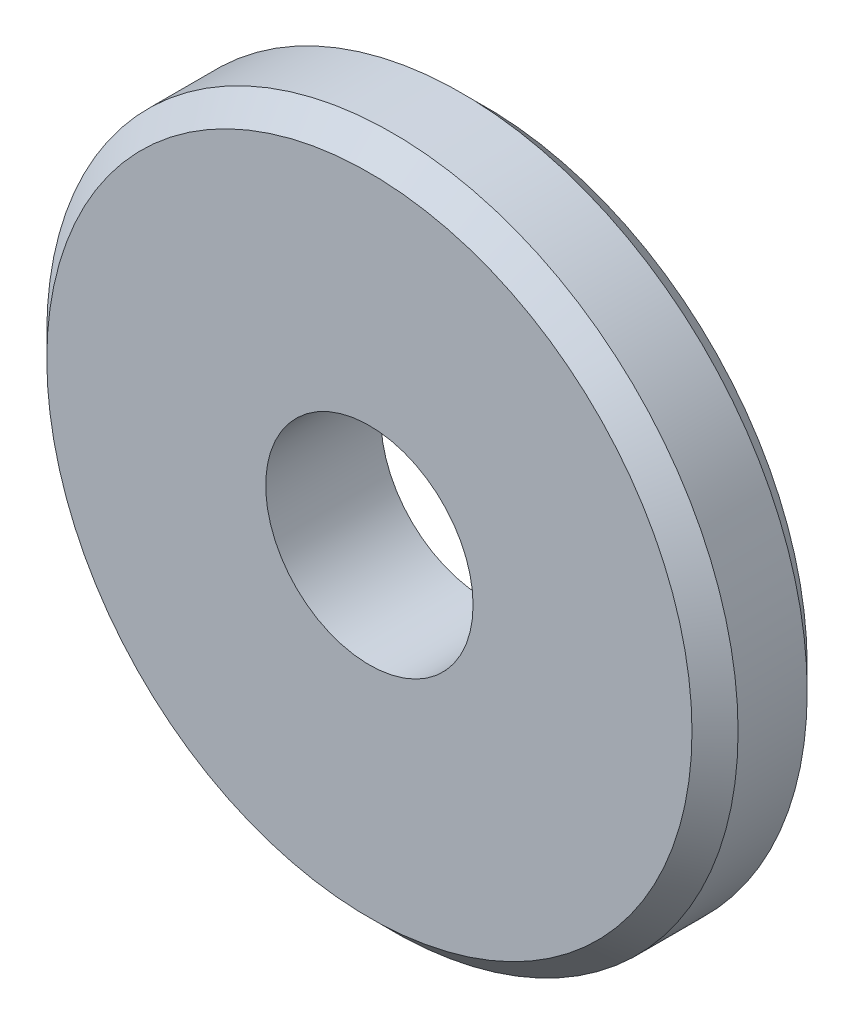
ISO-10303-21;
HEADER;
FILE_DESCRIPTION(('STEP AP214'),'2;1');
FILE_NAME('part.step','',(''),(''),'','','');
FILE_SCHEMA(('AUTOMOTIVE_DESIGN { 1 0 10303 214 1 1 1 1 }'));
ENDSEC;
DATA;
#1=APPLICATION_CONTEXT('core data for automotive mechanical design processes');
#2=APPLICATION_PROTOCOL_DEFINITION('international standard','automotive_design',2000,#1);
#3=PRODUCT_CONTEXT('',#1,'mechanical');
#4=PRODUCT('Part','Part','',(#3));
#5=PRODUCT_RELATED_PRODUCT_CATEGORY('part','',(#4));
#6=PRODUCT_DEFINITION_FORMATION('','',#4);
#7=PRODUCT_DEFINITION_CONTEXT('part definition',#1,'design');
#8=PRODUCT_DEFINITION('design','',#6,#7);
#9=PRODUCT_DEFINITION_SHAPE('','',#8);
#10=(LENGTH_UNIT() NAMED_UNIT(*) SI_UNIT(.MILLI.,.METRE.));
#11=(NAMED_UNIT(*) PLANE_ANGLE_UNIT() SI_UNIT($,.RADIAN.));
#12=(NAMED_UNIT(*) SI_UNIT($,.STERADIAN.) SOLID_ANGLE_UNIT());
#13=UNCERTAINTY_MEASURE_WITH_UNIT(LENGTH_MEASURE(1.E-05),#10,'distance_accuracy_value','');
#14=(GEOMETRIC_REPRESENTATION_CONTEXT(3) GLOBAL_UNCERTAINTY_ASSIGNED_CONTEXT((#13)) GLOBAL_UNIT_ASSIGNED_CONTEXT((#10,
#11,#12)) REPRESENTATION_CONTEXT('',''));
#15=CARTESIAN_POINT('',(0.,0.,0.));
#16=DIRECTION('',(0.,0.,1.));
#17=DIRECTION('',(1.,0.,0.));
#18=AXIS2_PLACEMENT_3D('',#15,#16,#17);
#19=CARTESIAN_POINT('',(0.,0.,5.));
#20=DIRECTION('',(0.,0.,1.));
#21=DIRECTION('',(1.,0.,0.));
#22=AXIS2_PLACEMENT_3D('',#19,#20,#21);
#23=PLANE('',#22);
#24=CARTESIAN_POINT('',(0.,0.,5.));
#25=DIRECTION('',(0.,0.,1.));
#26=DIRECTION('',(1.,0.,0.));
#27=AXIS2_PLACEMENT_3D('',#24,#25,#26);
#28=CIRCLE('',#27,14.);
#29=CARTESIAN_POINT('',(14.,0.,5.));
#30=VERTEX_POINT('',#29);
#31=EDGE_CURVE('E64',#30,#30,#28,.T.);
#32=ORIENTED_EDGE('',*,*,#31,.T.);
#33=EDGE_LOOP('',(#32));
#34=FACE_BOUND('',#33,.T.);
#35=CARTESIAN_POINT('',(0.,0.,5.));
#36=DIRECTION('',(0.,0.,1.));
#37=DIRECTION('',(1.,0.,0.));
#38=AXIS2_PLACEMENT_3D('',#35,#36,#37);
#39=CIRCLE('',#38,4.5);
#40=CARTESIAN_POINT('',(4.5,0.,5.));
#41=VERTEX_POINT('',#40);
#42=EDGE_CURVE('E70',#41,#41,#39,.T.);
#43=ORIENTED_EDGE('',*,*,#42,.F.);
#44=EDGE_LOOP('',(#43));
#45=FACE_BOUND('',#44,.T.);
#46=ADVANCED_FACE('F45',(#34,#45),#23,.T.);
#47=CARTESIAN_POINT('',(0.,0.,0.));
#48=DIRECTION('',(0.,0.,1.));
#49=DIRECTION('',(1.,0.,0.));
#50=AXIS2_PLACEMENT_3D('',#47,#48,#49);
#51=PLANE('',#50);
#52=CARTESIAN_POINT('',(0.,0.,0.));
#53=DIRECTION('',(0.,0.,1.));
#54=DIRECTION('',(1.,0.,0.));
#55=AXIS2_PLACEMENT_3D('',#52,#53,#54);
#56=CIRCLE('',#55,14.);
#57=CARTESIAN_POINT('',(14.,0.,0.));
#58=VERTEX_POINT('',#57);
#59=EDGE_CURVE('E11',#58,#58,#56,.F.);
#60=ORIENTED_EDGE('',*,*,#59,.T.);
#61=EDGE_LOOP('',(#60));
#62=FACE_BOUND('',#61,.T.);
#63=CARTESIAN_POINT('',(0.,0.,0.));
#64=DIRECTION('',(0.,0.,1.));
#65=DIRECTION('',(1.,0.,0.));
#66=AXIS2_PLACEMENT_3D('',#63,#64,#65);
#67=CIRCLE('',#66,4.5);
#68=CARTESIAN_POINT('',(4.5,0.,0.));
#69=VERTEX_POINT('',#68);
#70=EDGE_CURVE('E71',#69,#69,#67,.T.);
#71=ORIENTED_EDGE('',*,*,#70,.T.);
#72=EDGE_LOOP('',(#71));
#73=FACE_BOUND('',#72,.T.);
#74=ADVANCED_FACE('F83',(#62,#73),#51,.F.);
#75=CARTESIAN_POINT('',(0.,0.,5.));
#76=DIRECTION('',(0.,0.,-1.));
#77=DIRECTION('',(-1.,0.,0.));
#78=AXIS2_PLACEMENT_3D('',#75,#76,#77);
#79=CYLINDRICAL_SURFACE('',#78,15.);
#80=CARTESIAN_POINT('',(0.,0.,4.));
#81=DIRECTION('',(0.,0.,1.));
#82=DIRECTION('',(1.,0.,0.));
#83=AXIS2_PLACEMENT_3D('',#80,#81,#82);
#84=CIRCLE('',#83,15.);
#85=CARTESIAN_POINT('',(15.,0.,4.));
#86=VERTEX_POINT('',#85);
#87=EDGE_CURVE('E54',#86,#86,#84,.F.);
#88=ORIENTED_EDGE('',*,*,#87,.T.);
#89=EDGE_LOOP('',(#88));
#90=FACE_BOUND('',#89,.T.);
#91=CARTESIAN_POINT('',(0.,0.,0.999999999999996));
#92=DIRECTION('',(0.,0.,1.));
#93=DIRECTION('',(1.,0.,0.));
#94=AXIS2_PLACEMENT_3D('',#91,#92,#93);
#95=CIRCLE('',#94,15.);
#96=CARTESIAN_POINT('',(15.,0.,0.999999999999996));
#97=VERTEX_POINT('',#96);
#98=EDGE_CURVE('E59',#97,#97,#95,.T.);
#99=ORIENTED_EDGE('',*,*,#98,.T.);
#100=EDGE_LOOP('',(#99));
#101=FACE_BOUND('',#100,.T.);
#102=ADVANCED_FACE('F89',(#90,#101),#79,.T.);
#103=CARTESIAN_POINT('',(0.,0.,5.));
#104=DIRECTION('',(0.,0.,-1.));
#105=DIRECTION('',(-1.,0.,0.));
#106=AXIS2_PLACEMENT_3D('',#103,#104,#105);
#107=CYLINDRICAL_SURFACE('',#106,4.5);
#108=ORIENTED_EDGE('',*,*,#42,.T.);
#109=EDGE_LOOP('',(#108));
#110=FACE_BOUND('',#109,.T.);
#111=ORIENTED_EDGE('',*,*,#70,.F.);
#112=EDGE_LOOP('',(#111));
#113=FACE_BOUND('',#112,.T.);
#114=ADVANCED_FACE('F79',(#110,#113),#107,.F.);
#115=CARTESIAN_POINT('',(0.,0.,5.));
#116=DIRECTION('',(0.,0.,-1.));
#117=DIRECTION('',(-1.,0.,0.));
#118=AXIS2_PLACEMENT_3D('',#115,#116,#117);
#119=CONICAL_SURFACE('',#118,14.,0.785398163397446);
#120=ORIENTED_EDGE('',*,*,#87,.F.);
#121=EDGE_LOOP('',(#120));
#122=FACE_BOUND('',#121,.T.);
#123=ORIENTED_EDGE('',*,*,#31,.F.);
#124=EDGE_LOOP('',(#123));
#125=FACE_BOUND('',#124,.T.);
#126=ADVANCED_FACE('F95',(#122,#125),#119,.T.);
#127=CARTESIAN_POINT('',(0.,0.,0.999999999999996));
#128=DIRECTION('',(0.,0.,1.));
#129=DIRECTION('',(1.,0.,0.));
#130=AXIS2_PLACEMENT_3D('',#127,#128,#129);
#131=CONICAL_SURFACE('',#130,15.,0.78539816339745);
#132=ORIENTED_EDGE('',*,*,#59,.F.);
#133=EDGE_LOOP('',(#132));
#134=FACE_BOUND('',#133,.T.);
#135=ORIENTED_EDGE('',*,*,#98,.F.);
#136=EDGE_LOOP('',(#135));
#137=FACE_BOUND('',#136,.T.);
#138=ADVANCED_FACE('F48',(#134,#137),#131,.T.);
#139=CLOSED_SHELL('',(#46,#74,#102,#114,#126,#138));
#140=MANIFOLD_SOLID_BREP('B2',#139);
#141=ADVANCED_BREP_SHAPE_REPRESENTATION('',(#18,#140),#14);
#142=SHAPE_DEFINITION_REPRESENTATION(#9,#141);
ENDSEC;
END-ISO-10303-21;
